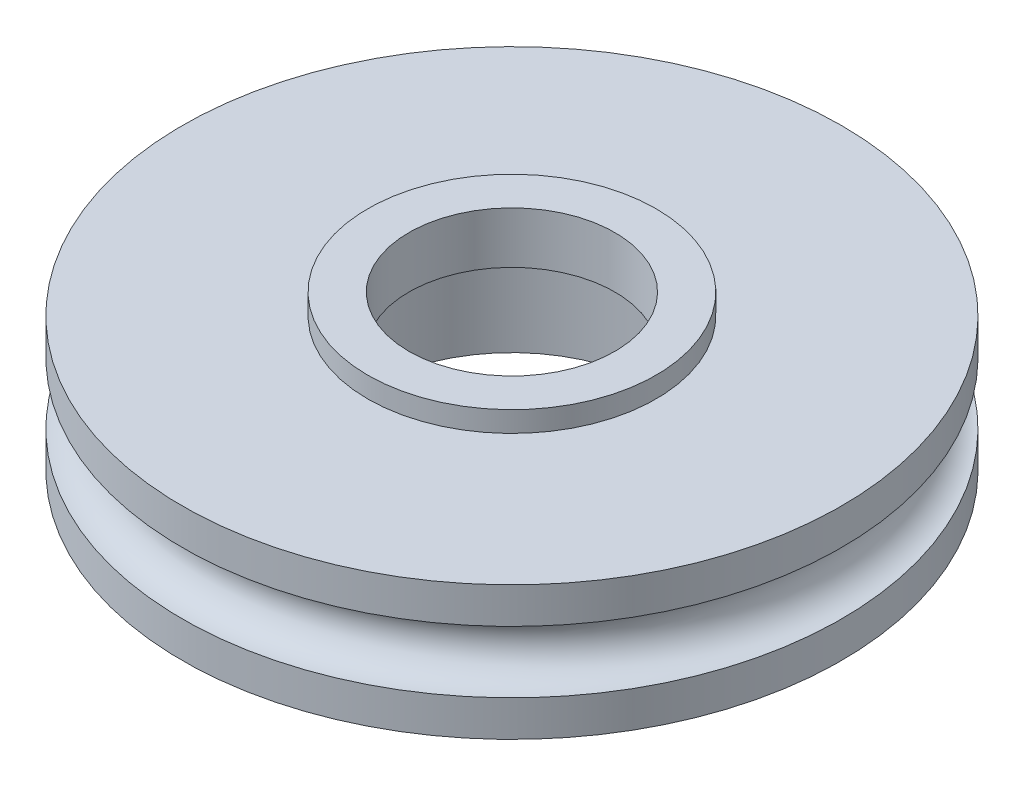
ISO-10303-21;
HEADER;
FILE_DESCRIPTION(('STEP AP214'),'2;1');
FILE_NAME('part.step','',(''),(''),'','','');
FILE_SCHEMA(('AUTOMOTIVE_DESIGN { 1 0 10303 214 1 1 1 1 }'));
ENDSEC;
DATA;
#1=APPLICATION_CONTEXT('core data for automotive mechanical design processes');
#2=APPLICATION_PROTOCOL_DEFINITION('international standard','automotive_design',2000,#1);
#3=PRODUCT_CONTEXT('',#1,'mechanical');
#4=PRODUCT('Part','Part','',(#3));
#5=PRODUCT_RELATED_PRODUCT_CATEGORY('part','',(#4));
#6=PRODUCT_DEFINITION_FORMATION('','',#4);
#7=PRODUCT_DEFINITION_CONTEXT('part definition',#1,'design');
#8=PRODUCT_DEFINITION('design','',#6,#7);
#9=PRODUCT_DEFINITION_SHAPE('','',#8);
#10=(LENGTH_UNIT() NAMED_UNIT(*) SI_UNIT(.MILLI.,.METRE.));
#11=(NAMED_UNIT(*) PLANE_ANGLE_UNIT() SI_UNIT($,.RADIAN.));
#12=(NAMED_UNIT(*) SI_UNIT($,.STERADIAN.) SOLID_ANGLE_UNIT());
#13=UNCERTAINTY_MEASURE_WITH_UNIT(LENGTH_MEASURE(1.E-05),#10,'distance_accuracy_value','');
#14=(GEOMETRIC_REPRESENTATION_CONTEXT(3) GLOBAL_UNCERTAINTY_ASSIGNED_CONTEXT((#13)) GLOBAL_UNIT_ASSIGNED_CONTEXT((#10,
#11,#12)) REPRESENTATION_CONTEXT('',''));
#15=CARTESIAN_POINT('',(0.,0.,0.));
#16=DIRECTION('',(0.,0.,1.));
#17=DIRECTION('',(1.,0.,0.));
#18=AXIS2_PLACEMENT_3D('',#15,#16,#17);
#19=CARTESIAN_POINT('',(0.,1.625,0.));
#20=DIRECTION('',(0.,1.,0.));
#21=DIRECTION('',(0.,0.,1.));
#22=AXIS2_PLACEMENT_3D('',#19,#20,#21);
#23=PLANE('',#22);
#24=CARTESIAN_POINT('',(0.,1.625,0.));
#25=DIRECTION('',(0.,1.,0.));
#26=DIRECTION('',(0.,0.,1.));
#27=AXIS2_PLACEMENT_3D('',#24,#25,#26);
#28=CIRCLE('',#27,8.);
#29=CARTESIAN_POINT('',(0.,1.625,-8.));
#30=VERTEX_POINT('',#29);
#31=EDGE_CURVE('E12',#30,#30,#28,.T.);
#32=ORIENTED_EDGE('',*,*,#31,.T.);
#33=EDGE_LOOP('',(#32));
#34=FACE_BOUND('',#33,.T.);
#35=CARTESIAN_POINT('',(0.,1.625,0.));
#36=DIRECTION('',(0.,1.,0.));
#37=DIRECTION('',(0.,0.,1.));
#38=AXIS2_PLACEMENT_3D('',#35,#36,#37);
#39=CIRCLE('',#38,3.5);
#40=CARTESIAN_POINT('',(0.,1.625,3.5));
#41=VERTEX_POINT('',#40);
#42=EDGE_CURVE('E77',#41,#41,#39,.T.);
#43=ORIENTED_EDGE('',*,*,#42,.F.);
#44=EDGE_LOOP('',(#43));
#45=FACE_BOUND('',#44,.T.);
#46=ADVANCED_FACE('F49',(#34,#45),#23,.T.);
#47=CARTESIAN_POINT('',(0.,1.625,0.));
#48=DIRECTION('',(0.,-1.,0.));
#49=DIRECTION('',(0.,0.,-1.));
#50=AXIS2_PLACEMENT_3D('',#47,#48,#49);
#51=CYLINDRICAL_SURFACE('',#50,3.5);
#52=CARTESIAN_POINT('',(0.,-1.625,0.));
#53=DIRECTION('',(0.,1.,0.));
#54=DIRECTION('',(0.,0.,1.));
#55=AXIS2_PLACEMENT_3D('',#52,#53,#54);
#56=CIRCLE('',#55,3.5);
#57=CARTESIAN_POINT('',(0.,-1.625,-3.5));
#58=VERTEX_POINT('',#57);
#59=EDGE_CURVE('E60',#58,#58,#56,.T.);
#60=CARTESIAN_POINT('',(0.,0.875,0.));
#61=DIRECTION('',(0.,1.,0.));
#62=DIRECTION('',(0.,0.,1.));
#63=AXIS2_PLACEMENT_3D('',#60,#61,#62);
#64=CIRCLE('',#63,3.5);
#65=CARTESIAN_POINT('',(0.,0.875,-3.5));
#66=VERTEX_POINT('',#65);
#67=EDGE_CURVE('E70',#66,#66,#64,.T.);
#68=CARTESIAN_POINT('',(0.,-1.625,-3.5));
#69=CARTESIAN_POINT('',(0.,-1.59895833333333,-3.5));
#70=CARTESIAN_POINT('',(0.,-1.57291666666667,-3.5));
#71=CARTESIAN_POINT('',(0.,-1.52083333333333,-3.5));
#72=CARTESIAN_POINT('',(0.,-1.49479166666667,-3.5));
#73=CARTESIAN_POINT('',(0.,-1.44270833333333,-3.5));
#74=CARTESIAN_POINT('',(0.,-1.41666666666667,-3.5));
#75=CARTESIAN_POINT('',(0.,-1.36458333333333,-3.5));
#76=CARTESIAN_POINT('',(0.,-1.33854166666667,-3.5));
#77=CARTESIAN_POINT('',(0.,-1.28645833333333,-3.5));
#78=CARTESIAN_POINT('',(0.,-1.26041666666667,-3.5));
#79=CARTESIAN_POINT('',(0.,-1.20833333333333,-3.5));
#80=CARTESIAN_POINT('',(0.,-1.18229166666667,-3.5));
#81=CARTESIAN_POINT('',(0.,-1.13020833333333,-3.5));
#82=CARTESIAN_POINT('',(0.,-1.10416666666667,-3.5));
#83=CARTESIAN_POINT('',(0.,-1.05208333333333,-3.5));
#84=CARTESIAN_POINT('',(0.,-1.02604166666667,-3.5));
#85=CARTESIAN_POINT('',(0.,-0.973958333333333,-3.5));
#86=CARTESIAN_POINT('',(0.,-0.947916666666667,-3.5));
#87=CARTESIAN_POINT('',(0.,-0.895833333333333,-3.5));
#88=CARTESIAN_POINT('',(0.,-0.869791666666667,-3.5));
#89=CARTESIAN_POINT('',(0.,-0.817708333333333,-3.5));
#90=CARTESIAN_POINT('',(0.,-0.791666666666667,-3.5));
#91=CARTESIAN_POINT('',(0.,-0.739583333333333,-3.5));
#92=CARTESIAN_POINT('',(0.,-0.713541666666667,-3.5));
#93=CARTESIAN_POINT('',(0.,-0.661458333333333,-3.5));
#94=CARTESIAN_POINT('',(0.,-0.635416666666667,-3.5));
#95=CARTESIAN_POINT('',(0.,-0.583333333333333,-3.5));
#96=CARTESIAN_POINT('',(0.,-0.557291666666667,-3.5));
#97=CARTESIAN_POINT('',(0.,-0.505208333333333,-3.5));
#98=CARTESIAN_POINT('',(0.,-0.479166666666666,-3.5));
#99=CARTESIAN_POINT('',(0.,-0.427083333333333,-3.5));
#100=CARTESIAN_POINT('',(0.,-0.401041666666666,-3.5));
#101=CARTESIAN_POINT('',(0.,-0.348958333333333,-3.5));
#102=CARTESIAN_POINT('',(0.,-0.322916666666667,-3.5));
#103=CARTESIAN_POINT('',(0.,-0.270833333333333,-3.5));
#104=CARTESIAN_POINT('',(0.,-0.244791666666667,-3.5));
#105=CARTESIAN_POINT('',(0.,-0.192708333333334,-3.5));
#106=CARTESIAN_POINT('',(0.,-0.166666666666667,-3.5));
#107=CARTESIAN_POINT('',(0.,-0.114583333333333,-3.5));
#108=CARTESIAN_POINT('',(0.,-0.0885416666666668,-3.5));
#109=CARTESIAN_POINT('',(0.,-0.0364583333333334,-3.5));
#110=CARTESIAN_POINT('',(0.,-0.0104166666666668,-3.5));
#111=CARTESIAN_POINT('',(0.,0.0416666666666665,-3.5));
#112=CARTESIAN_POINT('',(0.,0.0677083333333332,-3.5));
#113=CARTESIAN_POINT('',(0.,0.119791666666667,-3.5));
#114=CARTESIAN_POINT('',(0.,0.145833333333333,-3.5));
#115=CARTESIAN_POINT('',(0.,0.197916666666667,-3.5));
#116=CARTESIAN_POINT('',(0.,0.223958333333333,-3.5));
#117=CARTESIAN_POINT('',(0.,0.276041666666666,-3.5));
#118=CARTESIAN_POINT('',(0.,0.302083333333333,-3.5));
#119=CARTESIAN_POINT('',(0.,0.354166666666667,-3.5));
#120=CARTESIAN_POINT('',(0.,0.380208333333333,-3.5));
#121=CARTESIAN_POINT('',(0.,0.432291666666667,-3.5));
#122=CARTESIAN_POINT('',(0.,0.458333333333333,-3.5));
#123=CARTESIAN_POINT('',(0.,0.510416666666667,-3.5));
#124=CARTESIAN_POINT('',(0.,0.536458333333333,-3.5));
#125=CARTESIAN_POINT('',(0.,0.588541666666667,-3.5));
#126=CARTESIAN_POINT('',(0.,0.614583333333333,-3.5));
#127=CARTESIAN_POINT('',(0.,0.666666666666666,-3.5));
#128=CARTESIAN_POINT('',(0.,0.692708333333333,-3.5));
#129=CARTESIAN_POINT('',(0.,0.744791666666666,-3.5));
#130=CARTESIAN_POINT('',(0.,0.770833333333333,-3.5));
#131=CARTESIAN_POINT('',(0.,0.822916666666666,-3.5));
#132=CARTESIAN_POINT('',(0.,0.848958333333333,-3.5));
#133=CARTESIAN_POINT('',(0.,0.875,-3.5));
#134=B_SPLINE_CURVE_WITH_KNOTS('',3,(#68,#69,#70,#71,#72,#73,#74,#75,#76,#77,#78,#79,#80,#81,
#82,#83,#84,#85,#86,#87,#88,#89,#90,#91,#92,#93,#94,#95,#96,#97,#98,#99,#100,#101,#102,#103,
#104,#105,#106,#107,#108,#109,#110,#111,#112,#113,#114,#115,#116,#117,#118,#119,#120,#121,#122,
#123,#124,#125,#126,#127,#128,#129,#130,#131,#132,#133),.UNSPECIFIED.,.F.,.F.,(4,2,2,2,2,2,2,2,
2,2,2,2,2,2,2,2,2,2,2,2,2,2,2,2,2,2,2,2,2,2,2,2,4),(0.,0.0781250000000001,0.15625,0.234375,
0.3125,0.390625,0.46875,0.546875,0.625,0.703125,0.78125,0.859375,0.9375,1.015625,1.09375,
1.171875,1.25,1.328125,1.40625,1.484375,1.5625,1.640625,1.71875,1.796875,1.875,1.953125,2.03125,
2.109375,2.1875,2.265625,2.34375,2.421875,2.5),.UNSPECIFIED.);
#135=EDGE_CURVE('BSEAM103',#58,#66,#134,.T.);
#136=ORIENTED_EDGE('',*,*,#59,.F.);
#137=ORIENTED_EDGE('',*,*,#67,.T.);
#138=ORIENTED_EDGE('',*,*,#135,.T.);
#139=ORIENTED_EDGE('',*,*,#135,.F.);
#140=EDGE_LOOP('',(#136,#138,#137,#139));
#141=FACE_BOUND('',#140,.T.);
#142=ADVANCED_FACE('F103',(#141),#51,.F.);
#143=CARTESIAN_POINT('',(0.,1.625,0.));
#144=DIRECTION('',(0.,-1.,0.));
#145=DIRECTION('',(0.,0.,-1.));
#146=AXIS2_PLACEMENT_3D('',#143,#144,#145);
#147=CYLINDRICAL_SURFACE('',#146,8.);
#148=CARTESIAN_POINT('',(0.,0.75,0.));
#149=DIRECTION('',(0.,1.,0.));
#150=DIRECTION('',(0.,0.,1.));
#151=AXIS2_PLACEMENT_3D('',#148,#149,#150);
#152=CIRCLE('',#151,8.);
#153=CARTESIAN_POINT('',(0.,0.75,-8.));
#154=VERTEX_POINT('',#153);
#155=EDGE_CURVE('E67',#154,#154,#152,.T.);
#156=CARTESIAN_POINT('',(0.,0.75,-8.));
#157=CARTESIAN_POINT('',(0.,0.759114583333333,-8.));
#158=CARTESIAN_POINT('',(0.,0.768229166666667,-8.));
#159=CARTESIAN_POINT('',(0.,0.786458333333333,-8.));
#160=CARTESIAN_POINT('',(0.,0.795572916666667,-8.));
#161=CARTESIAN_POINT('',(0.,0.813802083333333,-8.));
#162=CARTESIAN_POINT('',(0.,0.822916666666667,-8.));
#163=CARTESIAN_POINT('',(0.,0.841145833333333,-8.));
#164=CARTESIAN_POINT('',(0.,0.850260416666667,-8.));
#165=CARTESIAN_POINT('',(0.,0.868489583333333,-8.));
#166=CARTESIAN_POINT('',(0.,0.877604166666667,-8.));
#167=CARTESIAN_POINT('',(0.,0.895833333333333,-8.));
#168=CARTESIAN_POINT('',(0.,0.904947916666667,-8.));
#169=CARTESIAN_POINT('',(0.,0.923177083333333,-8.));
#170=CARTESIAN_POINT('',(0.,0.932291666666667,-8.));
#171=CARTESIAN_POINT('',(0.,0.950520833333333,-8.));
#172=CARTESIAN_POINT('',(0.,0.959635416666667,-8.));
#173=CARTESIAN_POINT('',(0.,0.977864583333333,-8.));
#174=CARTESIAN_POINT('',(0.,0.986979166666667,-8.));
#175=CARTESIAN_POINT('',(0.,1.00520833333333,-8.));
#176=CARTESIAN_POINT('',(0.,1.01432291666667,-8.));
#177=CARTESIAN_POINT('',(0.,1.03255208333333,-8.));
#178=CARTESIAN_POINT('',(0.,1.04166666666667,-8.));
#179=CARTESIAN_POINT('',(0.,1.05989583333333,-8.));
#180=CARTESIAN_POINT('',(0.,1.06901041666667,-8.));
#181=CARTESIAN_POINT('',(0.,1.08723958333333,-8.));
#182=CARTESIAN_POINT('',(0.,1.09635416666667,-8.));
#183=CARTESIAN_POINT('',(0.,1.11458333333333,-8.));
#184=CARTESIAN_POINT('',(0.,1.12369791666667,-8.));
#185=CARTESIAN_POINT('',(0.,1.14192708333333,-8.));
#186=CARTESIAN_POINT('',(0.,1.15104166666667,-8.));
#187=CARTESIAN_POINT('',(0.,1.16927083333333,-8.));
#188=CARTESIAN_POINT('',(0.,1.17838541666667,-8.));
#189=CARTESIAN_POINT('',(0.,1.19661458333333,-8.));
#190=CARTESIAN_POINT('',(0.,1.20572916666667,-8.));
#191=CARTESIAN_POINT('',(0.,1.22395833333333,-8.));
#192=CARTESIAN_POINT('',(0.,1.23307291666667,-8.));
#193=CARTESIAN_POINT('',(0.,1.25130208333333,-8.));
#194=CARTESIAN_POINT('',(0.,1.26041666666667,-8.));
#195=CARTESIAN_POINT('',(0.,1.27864583333333,-8.));
#196=CARTESIAN_POINT('',(0.,1.28776041666667,-8.));
#197=CARTESIAN_POINT('',(0.,1.30598958333333,-8.));
#198=CARTESIAN_POINT('',(0.,1.31510416666667,-8.));
#199=CARTESIAN_POINT('',(0.,1.33333333333333,-8.));
#200=CARTESIAN_POINT('',(0.,1.34244791666667,-8.));
#201=CARTESIAN_POINT('',(0.,1.36067708333333,-8.));
#202=CARTESIAN_POINT('',(0.,1.36979166666667,-8.));
#203=CARTESIAN_POINT('',(0.,1.38802083333333,-8.));
#204=CARTESIAN_POINT('',(0.,1.39713541666667,-8.));
#205=CARTESIAN_POINT('',(0.,1.41536458333333,-8.));
#206=CARTESIAN_POINT('',(0.,1.42447916666667,-8.));
#207=CARTESIAN_POINT('',(0.,1.44270833333333,-8.));
#208=CARTESIAN_POINT('',(0.,1.45182291666667,-8.));
#209=CARTESIAN_POINT('',(0.,1.47005208333333,-8.));
#210=CARTESIAN_POINT('',(0.,1.47916666666667,-8.));
#211=CARTESIAN_POINT('',(0.,1.49739583333333,-8.));
#212=CARTESIAN_POINT('',(0.,1.50651041666667,-8.));
#213=CARTESIAN_POINT('',(0.,1.52473958333333,-8.));
#214=CARTESIAN_POINT('',(0.,1.53385416666667,-8.));
#215=CARTESIAN_POINT('',(0.,1.55208333333333,-8.));
#216=CARTESIAN_POINT('',(0.,1.56119791666667,-8.));
#217=CARTESIAN_POINT('',(0.,1.57942708333333,-8.));
#218=CARTESIAN_POINT('',(0.,1.58854166666667,-8.));
#219=CARTESIAN_POINT('',(0.,1.60677083333333,-8.));
#220=CARTESIAN_POINT('',(0.,1.61588541666667,-8.));
#221=CARTESIAN_POINT('',(0.,1.625,-8.));
#222=B_SPLINE_CURVE_WITH_KNOTS('',3,(#156,#157,#158,#159,#160,#161,#162,#163,#164,#165,#166,
#167,#168,#169,#170,#171,#172,#173,#174,#175,#176,#177,#178,#179,#180,#181,#182,#183,#184,#185,
#186,#187,#188,#189,#190,#191,#192,#193,#194,#195,#196,#197,#198,#199,#200,#201,#202,#203,#204,
#205,#206,#207,#208,#209,#210,#211,#212,#213,#214,#215,#216,#217,#218,#219,#220,#221),
.UNSPECIFIED.,.F.,.F.,(4,2,2,2,2,2,2,2,2,2,2,2,2,2,2,2,2,2,2,2,2,2,2,2,2,2,2,2,2,2,2,2,4),(0.,
0.02734375,0.0546874999999999,0.08203125,0.109375,0.13671875,0.1640625,0.19140625,0.21875,
0.24609375,0.2734375,0.30078125,0.328125,0.35546875,0.3828125,0.41015625,0.4375,0.46484375,
0.4921875,0.51953125,0.546875,0.57421875,0.6015625,0.62890625,0.65625,0.68359375,0.7109375,
0.73828125,0.765625,0.79296875,0.8203125,0.84765625,0.875),.UNSPECIFIED.);
#223=EDGE_CURVE('BSEAM108',#154,#30,#222,.T.);
#224=ORIENTED_EDGE('',*,*,#155,.T.);
#225=ORIENTED_EDGE('',*,*,#31,.F.);
#226=ORIENTED_EDGE('',*,*,#223,.T.);
#227=ORIENTED_EDGE('',*,*,#223,.F.);
#228=EDGE_LOOP('',(#224,#226,#225,#227));
#229=FACE_BOUND('',#228,.T.);
#230=ADVANCED_FACE('F108',(#229),#147,.T.);
#231=CARTESIAN_POINT('',(0.,-1.625,0.));
#232=DIRECTION('',(0.,1.,0.));
#233=DIRECTION('',(0.,0.,1.));
#234=AXIS2_PLACEMENT_3D('',#231,#232,#233);
#235=PLANE('',#234);
#236=CARTESIAN_POINT('',(0.,-1.625,0.));
#237=DIRECTION('',(0.,1.,0.));
#238=DIRECTION('',(0.,0.,1.));
#239=AXIS2_PLACEMENT_3D('',#236,#237,#238);
#240=CIRCLE('',#239,8.);
#241=CARTESIAN_POINT('',(0.,-1.625,-8.));
#242=VERTEX_POINT('',#241);
#243=EDGE_CURVE('E53',#242,#242,#240,.T.);
#244=ORIENTED_EDGE('',*,*,#243,.F.);
#245=EDGE_LOOP('',(#244));
#246=FACE_BOUND('',#245,.T.);
#247=ORIENTED_EDGE('',*,*,#59,.T.);
#248=EDGE_LOOP('',(#247));
#249=FACE_BOUND('',#248,.T.);
#250=ADVANCED_FACE('F113',(#246,#249),#235,.F.);
#251=CARTESIAN_POINT('',(0.,-0.75,0.));
#252=DIRECTION('',(0.,1.,0.));
#253=DIRECTION('',(0.,0.,1.));
#254=AXIS2_PLACEMENT_3D('',#251,#252,#253);
#255=CIRCLE('',#254,8.);
#256=CARTESIAN_POINT('',(0.,-0.75,-8.));
#257=VERTEX_POINT('',#256);
#258=EDGE_CURVE('E64',#257,#257,#255,.T.);
#259=CARTESIAN_POINT('',(0.,-0.75,-8.));
#260=CARTESIAN_POINT('',(0.,-0.759114583333333,-8.));
#261=CARTESIAN_POINT('',(0.,-0.768229166666667,-8.));
#262=CARTESIAN_POINT('',(0.,-0.786458333333333,-8.));
#263=CARTESIAN_POINT('',(0.,-0.795572916666667,-8.));
#264=CARTESIAN_POINT('',(0.,-0.813802083333333,-8.));
#265=CARTESIAN_POINT('',(0.,-0.822916666666667,-8.));
#266=CARTESIAN_POINT('',(0.,-0.841145833333333,-8.));
#267=CARTESIAN_POINT('',(0.,-0.850260416666667,-8.));
#268=CARTESIAN_POINT('',(0.,-0.868489583333333,-8.));
#269=CARTESIAN_POINT('',(0.,-0.877604166666667,-8.));
#270=CARTESIAN_POINT('',(0.,-0.895833333333333,-8.));
#271=CARTESIAN_POINT('',(0.,-0.904947916666667,-8.));
#272=CARTESIAN_POINT('',(0.,-0.923177083333333,-8.));
#273=CARTESIAN_POINT('',(0.,-0.932291666666667,-8.));
#274=CARTESIAN_POINT('',(0.,-0.950520833333333,-8.));
#275=CARTESIAN_POINT('',(0.,-0.959635416666667,-8.));
#276=CARTESIAN_POINT('',(0.,-0.977864583333333,-8.));
#277=CARTESIAN_POINT('',(0.,-0.986979166666667,-8.));
#278=CARTESIAN_POINT('',(0.,-1.00520833333333,-8.));
#279=CARTESIAN_POINT('',(0.,-1.01432291666667,-8.));
#280=CARTESIAN_POINT('',(0.,-1.03255208333333,-8.));
#281=CARTESIAN_POINT('',(0.,-1.04166666666667,-8.));
#282=CARTESIAN_POINT('',(0.,-1.05989583333333,-8.));
#283=CARTESIAN_POINT('',(0.,-1.06901041666667,-8.));
#284=CARTESIAN_POINT('',(0.,-1.08723958333333,-8.));
#285=CARTESIAN_POINT('',(0.,-1.09635416666667,-8.));
#286=CARTESIAN_POINT('',(0.,-1.11458333333333,-8.));
#287=CARTESIAN_POINT('',(0.,-1.12369791666667,-8.));
#288=CARTESIAN_POINT('',(0.,-1.14192708333333,-8.));
#289=CARTESIAN_POINT('',(0.,-1.15104166666667,-8.));
#290=CARTESIAN_POINT('',(0.,-1.16927083333333,-8.));
#291=CARTESIAN_POINT('',(0.,-1.17838541666667,-8.));
#292=CARTESIAN_POINT('',(0.,-1.19661458333333,-8.));
#293=CARTESIAN_POINT('',(0.,-1.20572916666667,-8.));
#294=CARTESIAN_POINT('',(0.,-1.22395833333333,-8.));
#295=CARTESIAN_POINT('',(0.,-1.23307291666667,-8.));
#296=CARTESIAN_POINT('',(0.,-1.25130208333333,-8.));
#297=CARTESIAN_POINT('',(0.,-1.26041666666667,-8.));
#298=CARTESIAN_POINT('',(0.,-1.27864583333333,-8.));
#299=CARTESIAN_POINT('',(0.,-1.28776041666667,-8.));
#300=CARTESIAN_POINT('',(0.,-1.30598958333333,-8.));
#301=CARTESIAN_POINT('',(0.,-1.31510416666667,-8.));
#302=CARTESIAN_POINT('',(0.,-1.33333333333333,-8.));
#303=CARTESIAN_POINT('',(0.,-1.34244791666667,-8.));
#304=CARTESIAN_POINT('',(0.,-1.36067708333333,-8.));
#305=CARTESIAN_POINT('',(0.,-1.36979166666667,-8.));
#306=CARTESIAN_POINT('',(0.,-1.38802083333333,-8.));
#307=CARTESIAN_POINT('',(0.,-1.39713541666667,-8.));
#308=CARTESIAN_POINT('',(0.,-1.41536458333333,-8.));
#309=CARTESIAN_POINT('',(0.,-1.42447916666667,-8.));
#310=CARTESIAN_POINT('',(0.,-1.44270833333333,-8.));
#311=CARTESIAN_POINT('',(0.,-1.45182291666667,-8.));
#312=CARTESIAN_POINT('',(0.,-1.47005208333333,-8.));
#313=CARTESIAN_POINT('',(0.,-1.47916666666667,-8.));
#314=CARTESIAN_POINT('',(0.,-1.49739583333333,-8.));
#315=CARTESIAN_POINT('',(0.,-1.50651041666667,-8.));
#316=CARTESIAN_POINT('',(0.,-1.52473958333333,-8.));
#317=CARTESIAN_POINT('',(0.,-1.53385416666667,-8.));
#318=CARTESIAN_POINT('',(0.,-1.55208333333333,-8.));
#319=CARTESIAN_POINT('',(0.,-1.56119791666667,-8.));
#320=CARTESIAN_POINT('',(0.,-1.57942708333333,-8.));
#321=CARTESIAN_POINT('',(0.,-1.58854166666667,-8.));
#322=CARTESIAN_POINT('',(0.,-1.60677083333333,-8.));
#323=CARTESIAN_POINT('',(0.,-1.61588541666667,-8.));
#324=CARTESIAN_POINT('',(0.,-1.625,-8.));
#325=B_SPLINE_CURVE_WITH_KNOTS('',3,(#259,#260,#261,#262,#263,#264,#265,#266,#267,#268,#269,
#270,#271,#272,#273,#274,#275,#276,#277,#278,#279,#280,#281,#282,#283,#284,#285,#286,#287,#288,
#289,#290,#291,#292,#293,#294,#295,#296,#297,#298,#299,#300,#301,#302,#303,#304,#305,#306,#307,
#308,#309,#310,#311,#312,#313,#314,#315,#316,#317,#318,#319,#320,#321,#322,#323,#324),
.UNSPECIFIED.,.F.,.F.,(4,2,2,2,2,2,2,2,2,2,2,2,2,2,2,2,2,2,2,2,2,2,2,2,2,2,2,2,2,2,2,2,4),(0.,
0.02734375,0.0546875,0.0820312500000001,0.109375,0.13671875,0.1640625,0.19140625,0.21875,
0.24609375,0.2734375,0.30078125,0.328125,0.35546875,0.3828125,0.41015625,0.4375,0.46484375,
0.4921875,0.51953125,0.546875,0.57421875,0.6015625,0.62890625,0.65625,0.68359375,0.7109375,
0.73828125,0.765625,0.79296875,0.8203125,0.84765625,0.875),.UNSPECIFIED.);
#326=EDGE_CURVE('BSEAM51',#257,#242,#325,.T.);
#327=ORIENTED_EDGE('',*,*,#258,.F.);
#328=ORIENTED_EDGE('',*,*,#243,.T.);
#329=ORIENTED_EDGE('',*,*,#326,.T.);
#330=ORIENTED_EDGE('',*,*,#326,.F.);
#331=EDGE_LOOP('',(#327,#329,#328,#330));
#332=FACE_BOUND('',#331,.T.);
#333=ADVANCED_FACE('F51',(#332),#147,.T.);
#334=CARTESIAN_POINT('',(0.,0.,0.));
#335=DIRECTION('',(0.,1.,0.));
#336=DIRECTION('',(0.,0.,1.));
#337=AXIS2_PLACEMENT_3D('',#334,#335,#336);
#338=TOROIDAL_SURFACE('',#337,8.,0.75);
#339=ORIENTED_EDGE('',*,*,#155,.F.);
#340=EDGE_LOOP('',(#339));
#341=FACE_BOUND('',#340,.T.);
#342=ORIENTED_EDGE('',*,*,#258,.T.);
#343=EDGE_LOOP('',(#342));
#344=FACE_BOUND('',#343,.T.);
#345=ADVANCED_FACE('F120',(#341,#344),#338,.F.);
#346=CARTESIAN_POINT('',(0.,0.875,0.));
#347=DIRECTION('',(0.,1.,0.));
#348=DIRECTION('',(0.,0.,1.));
#349=AXIS2_PLACEMENT_3D('',#346,#347,#348);
#350=PLANE('',#349);
#351=CARTESIAN_POINT('',(0.,0.875,0.));
#352=DIRECTION('',(0.,1.,0.));
#353=DIRECTION('',(0.,0.,1.));
#354=AXIS2_PLACEMENT_3D('',#351,#352,#353);
#355=CIRCLE('',#354,2.5);
#356=CARTESIAN_POINT('',(0.,0.875,2.5));
#357=VERTEX_POINT('',#356);
#358=EDGE_CURVE('E73',#357,#357,#355,.T.);
#359=ORIENTED_EDGE('',*,*,#358,.T.);
#360=EDGE_LOOP('',(#359));
#361=FACE_BOUND('',#360,.T.);
#362=ORIENTED_EDGE('',*,*,#67,.F.);
#363=EDGE_LOOP('',(#362));
#364=FACE_BOUND('',#363,.T.);
#365=ADVANCED_FACE('F99',(#361,#364),#350,.F.);
#366=CARTESIAN_POINT('',(0.,0.875,0.));
#367=DIRECTION('',(0.,1.,0.));
#368=DIRECTION('',(0.,0.,1.));
#369=AXIS2_PLACEMENT_3D('',#366,#367,#368);
#370=CYLINDRICAL_SURFACE('',#369,2.5);
#371=ORIENTED_EDGE('',*,*,#358,.F.);
#372=EDGE_LOOP('',(#371));
#373=FACE_BOUND('',#372,.T.);
#374=CARTESIAN_POINT('',(0.,2.125,0.));
#375=DIRECTION('',(0.,1.,0.));
#376=DIRECTION('',(0.,0.,1.));
#377=AXIS2_PLACEMENT_3D('',#374,#375,#376);
#378=CIRCLE('',#377,2.5);
#379=CARTESIAN_POINT('',(0.,2.125,2.5));
#380=VERTEX_POINT('',#379);
#381=EDGE_CURVE('E80',#380,#380,#378,.T.);
#382=ORIENTED_EDGE('',*,*,#381,.T.);
#383=EDGE_LOOP('',(#382));
#384=FACE_BOUND('',#383,.T.);
#385=ADVANCED_FACE('F86',(#373,#384),#370,.F.);
#386=CARTESIAN_POINT('',(0.,2.125,0.));
#387=DIRECTION('',(0.,1.,0.));
#388=DIRECTION('',(0.,0.,1.));
#389=AXIS2_PLACEMENT_3D('',#386,#387,#388);
#390=PLANE('',#389);
#391=CARTESIAN_POINT('',(0.,2.125,0.));
#392=DIRECTION('',(0.,1.,0.));
#393=DIRECTION('',(0.,0.,1.));
#394=AXIS2_PLACEMENT_3D('',#391,#392,#393);
#395=CIRCLE('',#394,3.5);
#396=CARTESIAN_POINT('',(0.,2.125,3.5));
#397=VERTEX_POINT('',#396);
#398=EDGE_CURVE('E76',#397,#397,#395,.T.);
#399=ORIENTED_EDGE('',*,*,#398,.T.);
#400=EDGE_LOOP('',(#399));
#401=FACE_BOUND('',#400,.T.);
#402=ORIENTED_EDGE('',*,*,#381,.F.);
#403=EDGE_LOOP('',(#402));
#404=FACE_BOUND('',#403,.T.);
#405=ADVANCED_FACE('F88',(#401,#404),#390,.T.);
#406=CARTESIAN_POINT('',(0.,2.125,0.));
#407=DIRECTION('',(0.,-1.,0.));
#408=DIRECTION('',(0.,0.,-1.));
#409=AXIS2_PLACEMENT_3D('',#406,#407,#408);
#410=CYLINDRICAL_SURFACE('',#409,3.5);
#411=ORIENTED_EDGE('',*,*,#398,.F.);
#412=EDGE_LOOP('',(#411));
#413=FACE_BOUND('',#412,.T.);
#414=ORIENTED_EDGE('',*,*,#42,.T.);
#415=EDGE_LOOP('',(#414));
#416=FACE_BOUND('',#415,.T.);
#417=ADVANCED_FACE('F90',(#413,#416),#410,.T.);
#418=CLOSED_SHELL('',(#46,#142,#230,#250,#333,#345,#365,#385,#405,#417));
#419=MANIFOLD_SOLID_BREP('B2',#418);
#420=ADVANCED_BREP_SHAPE_REPRESENTATION('',(#18,#419),#14);
#421=SHAPE_DEFINITION_REPRESENTATION(#9,#420);
ENDSEC;
END-ISO-10303-21;
